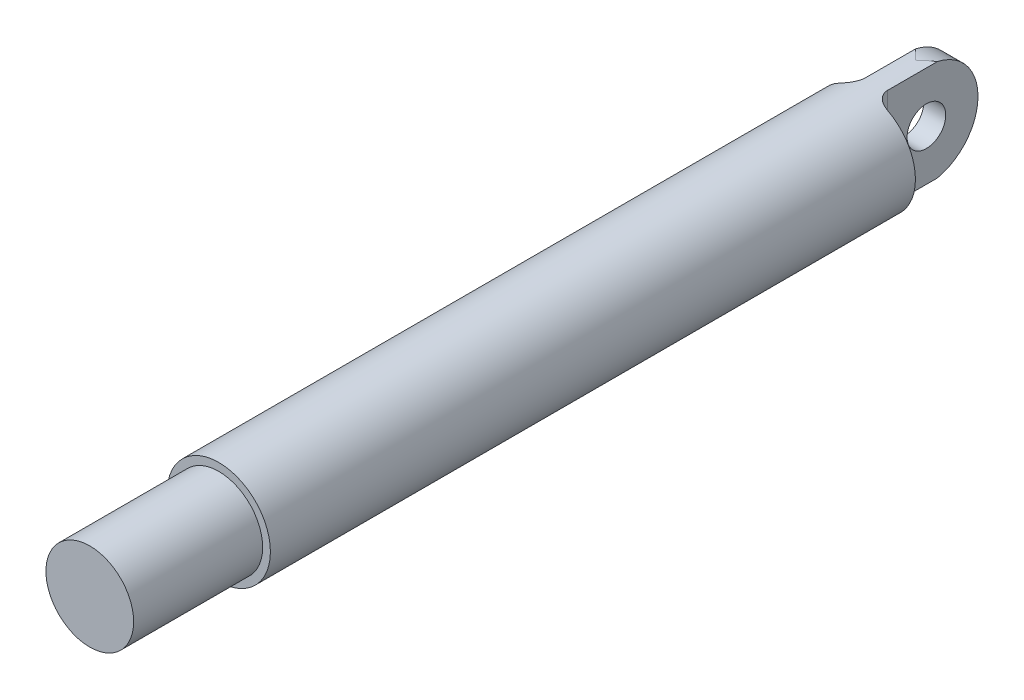
ISO-10303-21;
HEADER;
FILE_DESCRIPTION(('STEP AP214'),'2;1');
FILE_NAME('part.step','',(''),(''),'','','');
FILE_SCHEMA(('AUTOMOTIVE_DESIGN { 1 0 10303 214 1 1 1 1 }'));
ENDSEC;
DATA;
#1=APPLICATION_CONTEXT('core data for automotive mechanical design processes');
#2=APPLICATION_PROTOCOL_DEFINITION('international standard','automotive_design',2000,#1);
#3=PRODUCT_CONTEXT('',#1,'mechanical');
#4=PRODUCT('Part','Part','',(#3));
#5=PRODUCT_RELATED_PRODUCT_CATEGORY('part','',(#4));
#6=PRODUCT_DEFINITION_FORMATION('','',#4);
#7=PRODUCT_DEFINITION_CONTEXT('part definition',#1,'design');
#8=PRODUCT_DEFINITION('design','',#6,#7);
#9=PRODUCT_DEFINITION_SHAPE('','',#8);
#10=(LENGTH_UNIT() NAMED_UNIT(*) SI_UNIT(.MILLI.,.METRE.));
#11=(NAMED_UNIT(*) PLANE_ANGLE_UNIT() SI_UNIT($,.RADIAN.));
#12=(NAMED_UNIT(*) SI_UNIT($,.STERADIAN.) SOLID_ANGLE_UNIT());
#13=UNCERTAINTY_MEASURE_WITH_UNIT(LENGTH_MEASURE(1.E-05),#10,'distance_accuracy_value','');
#14=(GEOMETRIC_REPRESENTATION_CONTEXT(3) GLOBAL_UNCERTAINTY_ASSIGNED_CONTEXT((#13)) GLOBAL_UNIT_ASSIGNED_CONTEXT((#10,
#11,#12)) REPRESENTATION_CONTEXT('',''));
#15=CARTESIAN_POINT('',(0.,0.,0.));
#16=DIRECTION('',(0.,0.,1.));
#17=DIRECTION('',(1.,0.,0.));
#18=AXIS2_PLACEMENT_3D('',#15,#16,#17);
#19=CARTESIAN_POINT('',(4.25,0.,-270.));
#20=DIRECTION('',(1.,0.,0.));
#21=DIRECTION('',(0.,0.,-1.));
#22=AXIS2_PLACEMENT_3D('',#19,#20,#21);
#23=PLANE('',#22);
#24=CARTESIAN_POINT('',(4.25,0.,-270.));
#25=DIRECTION('',(1.,0.,0.));
#26=DIRECTION('',(0.,0.,-1.));
#27=AXIS2_PLACEMENT_3D('',#24,#25,#26);
#28=CIRCLE('',#27,7.50000000000001);
#29=CARTESIAN_POINT('',(4.25,0.,-277.5));
#30=VERTEX_POINT('',#29);
#31=EDGE_CURVE('E122',#30,#30,#28,.T.);
#32=ORIENTED_EDGE('',*,*,#31,.F.);
#33=EDGE_LOOP('',(#32));
#34=FACE_BOUND('',#33,.T.);
#35=DIRECTION('',(0.,0.,-1.));
#36=VECTOR('',#35,1.);
#37=CARTESIAN_POINT('',(4.25,19.5432213311931,50.));
#38=LINE('',#37,#36);
#39=CARTESIAN_POINT('',(4.25,19.5432213311931,-274.25));
#40=VERTEX_POINT('',#39);
#41=CARTESIAN_POINT('',(4.25,19.5432213311931,-255.));
#42=VERTEX_POINT('',#41);
#43=EDGE_CURVE('E190',#40,#42,#38,.F.);
#44=ORIENTED_EDGE('',*,*,#43,.T.);
#45=DIRECTION('',(0.,-1.,0.));
#46=VECTOR('',#45,1.);
#47=CARTESIAN_POINT('',(4.25,0.,-255.));
#48=LINE('',#47,#46);
#49=CARTESIAN_POINT('',(4.25,-19.5432213311931,-255.));
#50=VERTEX_POINT('',#49);
#51=EDGE_CURVE('E147',#42,#50,#48,.T.);
#52=ORIENTED_EDGE('',*,*,#51,.T.);
#53=DIRECTION('',(0.,0.,-1.));
#54=VECTOR('',#53,1.);
#55=CARTESIAN_POINT('',(4.25,-19.5432213311931,50.));
#56=LINE('',#55,#54);
#57=CARTESIAN_POINT('',(4.25,-19.5432213311931,-274.25));
#58=VERTEX_POINT('',#57);
#59=EDGE_CURVE('E188',#50,#58,#56,.T.);
#60=ORIENTED_EDGE('',*,*,#59,.T.);
#61=CARTESIAN_POINT('',(4.25,0.,-270.));
#62=DIRECTION('',(1.,0.,0.));
#63=DIRECTION('',(0.,0.,-1.));
#64=AXIS2_PLACEMENT_3D('',#61,#62,#63);
#65=CIRCLE('',#64,20.);
#66=EDGE_CURVE('E121',#58,#40,#65,.T.);
#67=ORIENTED_EDGE('',*,*,#66,.T.);
#68=EDGE_LOOP('',(#44,#52,#60,#67));
#69=FACE_BOUND('',#68,.T.);
#70=ADVANCED_FACE('F35',(#34,#69),#23,.T.);
#71=CARTESIAN_POINT('',(-4.25,0.,-270.));
#72=DIRECTION('',(1.,0.,0.));
#73=DIRECTION('',(0.,0.,-1.));
#74=AXIS2_PLACEMENT_3D('',#71,#72,#73);
#75=PLANE('',#74);
#76=CARTESIAN_POINT('',(-4.25,0.,-270.));
#77=DIRECTION('',(1.,0.,0.));
#78=DIRECTION('',(0.,0.,-1.));
#79=AXIS2_PLACEMENT_3D('',#76,#77,#78);
#80=CIRCLE('',#79,7.50000000000001);
#81=CARTESIAN_POINT('',(-4.25,0.,-277.5));
#82=VERTEX_POINT('',#81);
#83=EDGE_CURVE('E128',#82,#82,#80,.T.);
#84=ORIENTED_EDGE('',*,*,#83,.T.);
#85=EDGE_LOOP('',(#84));
#86=FACE_BOUND('',#85,.T.);
#87=DIRECTION('',(0.,0.,-1.));
#88=VECTOR('',#87,1.);
#89=CARTESIAN_POINT('',(-4.25,-19.5432213311931,50.));
#90=LINE('',#89,#88);
#91=CARTESIAN_POINT('',(-4.25,-19.5432213311931,-255.));
#92=VERTEX_POINT('',#91);
#93=CARTESIAN_POINT('',(-4.25,-19.5432213311931,-274.25));
#94=VERTEX_POINT('',#93);
#95=EDGE_CURVE('E116',#92,#94,#90,.T.);
#96=ORIENTED_EDGE('',*,*,#95,.F.);
#97=DIRECTION('',(0.,-1.,0.));
#98=VECTOR('',#97,1.);
#99=CARTESIAN_POINT('',(-4.25,19.5432213311931,-255.));
#100=LINE('',#99,#98);
#101=CARTESIAN_POINT('',(-4.25,19.5432213311931,-255.));
#102=VERTEX_POINT('',#101);
#103=EDGE_CURVE('E115',#92,#102,#100,.F.);
#104=ORIENTED_EDGE('',*,*,#103,.T.);
#105=DIRECTION('',(0.,0.,-1.));
#106=VECTOR('',#105,1.);
#107=CARTESIAN_POINT('',(-4.25,19.5432213311931,50.));
#108=LINE('',#107,#106);
#109=CARTESIAN_POINT('',(-4.25,19.5432213311931,-274.25));
#110=VERTEX_POINT('',#109);
#111=EDGE_CURVE('E101',#110,#102,#108,.F.);
#112=ORIENTED_EDGE('',*,*,#111,.F.);
#113=CARTESIAN_POINT('',(-4.25,0.,-270.));
#114=DIRECTION('',(1.,0.,0.));
#115=DIRECTION('',(0.,0.,-1.));
#116=AXIS2_PLACEMENT_3D('',#113,#114,#115);
#117=CIRCLE('',#116,20.);
#118=EDGE_CURVE('E113',#94,#110,#117,.T.);
#119=ORIENTED_EDGE('',*,*,#118,.F.);
#120=EDGE_LOOP('',(#96,#104,#112,#119));
#121=FACE_BOUND('',#120,.T.);
#122=ADVANCED_FACE('F112',(#86,#121),#75,.F.);
#123=CARTESIAN_POINT('',(4.25,0.,-270.));
#124=DIRECTION('',(-1.,0.,0.));
#125=DIRECTION('',(0.,0.,1.));
#126=AXIS2_PLACEMENT_3D('',#123,#124,#125);
#127=CYLINDRICAL_SURFACE('',#126,20.);
#128=CARTESIAN_POINT('',(0.,0.,-270.));
#129=DIRECTION('',(-0.707106781186547,0.,-0.707106781186547));
#130=DIRECTION('',(-0.707106781186547,0.,0.707106781186547));
#131=AXIS2_PLACEMENT_3D('',#128,#129,#130);
#132=ELLIPSE('',#131,28.2842712474619,20.);
#133=CARTESIAN_POINT('',(0.,20.,-270.));
#134=VERTEX_POINT('',#133);
#135=EDGE_CURVE('E104',#40,#134,#132,.F.);
#136=ORIENTED_EDGE('',*,*,#135,.F.);
#137=ORIENTED_EDGE('',*,*,#66,.F.);
#138=CARTESIAN_POINT('',(0.,-20.,-270.));
#139=VERTEX_POINT('',#138);
#140=EDGE_CURVE('E184',#139,#58,#132,.F.);
#141=ORIENTED_EDGE('',*,*,#140,.F.);
#142=CARTESIAN_POINT('',(0.,0.,-270.));
#143=DIRECTION('',(-0.707106781186547,0.,0.707106781186547));
#144=DIRECTION('',(-0.707106781186547,0.,-0.707106781186547));
#145=AXIS2_PLACEMENT_3D('',#142,#143,#144);
#146=ELLIPSE('',#145,28.2842712474619,20.);
#147=EDGE_CURVE('E108',#94,#139,#146,.T.);
#148=ORIENTED_EDGE('',*,*,#147,.F.);
#149=ORIENTED_EDGE('',*,*,#118,.T.);
#150=EDGE_CURVE('E97',#134,#110,#146,.T.);
#151=ORIENTED_EDGE('',*,*,#150,.F.);
#152=EDGE_LOOP('',(#136,#137,#141,#148,#149,#151));
#153=FACE_BOUND('',#152,.T.);
#154=ADVANCED_FACE('F119',(#153),#127,.T.);
#155=CARTESIAN_POINT('',(0.,0.,-250.));
#156=DIRECTION('',(0.,0.,1.));
#157=DIRECTION('',(1.,0.,0.));
#158=AXIS2_PLACEMENT_3D('',#155,#156,#157);
#159=PLANE('',#158);
#160=CARTESIAN_POINT('',(0.,0.,-250.));
#161=DIRECTION('',(0.,0.,1.));
#162=DIRECTION('',(1.,0.,0.));
#163=AXIS2_PLACEMENT_3D('',#160,#161,#162);
#164=CIRCLE('',#163,20.);
#165=CARTESIAN_POINT('',(9.25,-17.7323856263053,-250.));
#166=VERTEX_POINT('',#165);
#167=CARTESIAN_POINT('',(9.25,17.7323856263053,-250.));
#168=VERTEX_POINT('',#167);
#169=EDGE_CURVE('E140',#166,#168,#164,.T.);
#170=ORIENTED_EDGE('',*,*,#169,.F.);
#171=DIRECTION('',(0.,-1.,0.));
#172=VECTOR('',#171,1.);
#173=CARTESIAN_POINT('',(9.25,0.,-250.));
#174=LINE('',#173,#172);
#175=EDGE_CURVE('E55',#166,#168,#174,.F.);
#176=ORIENTED_EDGE('',*,*,#175,.T.);
#177=EDGE_LOOP('',(#170,#176));
#178=FACE_BOUND('',#177,.T.);
#179=ADVANCED_FACE('F168',(#178),#159,.F.);
#180=CARTESIAN_POINT('',(0.,0.,-250.));
#181=DIRECTION('',(0.,0.,1.));
#182=DIRECTION('',(1.,0.,0.));
#183=AXIS2_PLACEMENT_3D('',#180,#181,#182);
#184=CYLINDRICAL_SURFACE('',#183,20.);
#185=ORIENTED_EDGE('',*,*,#59,.F.);
#186=CARTESIAN_POINT('',(4.25,-19.5432213311931,-255.));
#187=CARTESIAN_POINT('',(4.24998351807279,-19.5432140005202,-254.862610201135));
#188=CARTESIAN_POINT('',(4.25566209277612,-19.5419896706019,-254.725222330896));
#189=CARTESIAN_POINT('',(4.27829072997005,-19.5370539365754,-254.451428615182));
#190=CARTESIAN_POINT('',(4.29524030853453,-19.5333426392463,-254.315022727799));
#191=CARTESIAN_POINT('',(4.3402733337141,-19.5233841077366,-254.044273492912));
#192=CARTESIAN_POINT('',(4.36834737067822,-19.5171390166654,-253.909928501693));
#193=CARTESIAN_POINT('',(4.43539461891231,-19.502011755574,-253.644140061068));
#194=CARTESIAN_POINT('',(4.47436767373509,-19.4931296234063,-253.512696570041));
#195=CARTESIAN_POINT('',(4.56290804514425,-19.4725943860146,-253.253598251336));
#196=CARTESIAN_POINT('',(4.61247907921736,-19.4609403083046,-253.125944771034));
#197=CARTESIAN_POINT('',(4.72181123480039,-19.4347024339761,-252.875334689281));
#198=CARTESIAN_POINT('',(4.78157610062521,-19.4201175604899,-252.752379834076));
#199=CARTESIAN_POINT('',(4.91073862747078,-19.387858877555,-252.512149739803));
#200=CARTESIAN_POINT('',(4.9801310403857,-19.3701867496593,-252.394871453027));
#201=CARTESIAN_POINT('',(5.12800046888428,-19.331566148526,-252.166696490152));
#202=CARTESIAN_POINT('',(5.20648081755547,-19.3106164722209,-252.055802177904));
#203=CARTESIAN_POINT('',(5.37180556161835,-19.2652808897491,-251.841210577309));
#204=CARTESIAN_POINT('',(5.45864872095948,-19.2408954911474,-251.737512229261));
#205=CARTESIAN_POINT('',(5.63997480667982,-19.1885275567289,-251.537933784275));
#206=CARTESIAN_POINT('',(5.73446050301509,-19.1605437145078,-251.442056547531));
#207=CARTESIAN_POINT('',(5.93015478781701,-19.1008826851982,-251.258798579018));
#208=CARTESIAN_POINT('',(6.03135970452742,-19.0692075082282,-251.171413270072));
#209=CARTESIAN_POINT('',(6.23968778042244,-19.0020597890867,-251.005534220303));
#210=CARTESIAN_POINT('',(6.346813121334,-18.9665858424597,-250.927043790262));
#211=CARTESIAN_POINT('',(6.56744296544196,-18.8913326404711,-250.778411747313));
#212=CARTESIAN_POINT('',(6.6810120472705,-18.8515036427277,-250.708391223716));
#213=CARTESIAN_POINT('',(6.91230320159097,-18.7679299063046,-250.578145357074));
#214=CARTESIAN_POINT('',(7.0300267771558,-18.7241837414305,-250.517923604312));
#215=CARTESIAN_POINT('',(7.26868923325148,-18.6328332760223,-250.407429689805));
#216=CARTESIAN_POINT('',(7.38962972041244,-18.585227022366,-250.357162609751));
#217=CARTESIAN_POINT('',(7.63373440465237,-18.4863055923082,-250.266643972269));
#218=CARTESIAN_POINT('',(7.75689937522216,-18.4349891064158,-250.226395973468));
#219=CARTESIAN_POINT('',(8.10804542930168,-18.284432727115,-250.126431000466));
#220=CARTESIAN_POINT('',(8.33771061579063,-18.1809423148409,-250.078502136869));
#221=CARTESIAN_POINT('',(8.6812772645236,-18.0180900837307,-250.031102463793));
#222=CARTESIAN_POINT('',(8.79553265271883,-17.9625947387204,-250.019384371358));
#223=CARTESIAN_POINT('',(9.02336842925477,-17.849229624705,-250.003837377005));
#224=CARTESIAN_POINT('',(9.1369489755395,-17.7913604385432,-250.000006550233));
#225=CARTESIAN_POINT('',(9.25000000000001,-17.7323856263053,-250.));
#226=B_SPLINE_CURVE_WITH_KNOTS('',3,(#186,#187,#188,#189,#190,#191,#192,#193,#194,#195,#196,
#197,#198,#199,#200,#201,#202,#203,#204,#205,#206,#207,#208,#209,#210,#211,#212,#213,#214,#215,
#216,#217,#218,#219,#220,#221,#222,#223,#224,#225),.UNSPECIFIED.,.F.,.F.,(4,2,2,2,2,2,2,2,2,2,2,
2,2,2,2,2,2,2,2,4),(0.,0.412043965436492,0.824070240704146,1.23574874392357,1.64742133811142,
2.05923857361914,2.47120740150374,2.88295253556501,3.2948491622613,3.70668500246844,
4.11867078284133,4.53043325531972,4.94234849089708,5.35959045287343,5.77698495026369,
6.19459197424433,6.61234711497267,7.37877720630159,7.76124252081663,8.14361448516319),.UNSPECIFIED.);
#227=EDGE_CURVE('E49',#50,#166,#226,.T.);
#228=ORIENTED_EDGE('',*,*,#227,.T.);
#229=ORIENTED_EDGE('',*,*,#169,.T.);
#230=CARTESIAN_POINT('',(9.25,17.7323856263053,-250.));
#231=CARTESIAN_POINT('',(9.11174785486749,17.8045225289416,-249.9999890528));
#232=CARTESIAN_POINT('',(8.97260746960244,17.8750294432244,-250.005734583656));
#233=CARTESIAN_POINT('',(8.6934556011172,18.0124365497774,-250.029098624584));
#234=CARTESIAN_POINT('',(8.55344368373647,18.0793347516506,-250.046723615937));
#235=CARTESIAN_POINT('',(8.2731767617439,18.2092976953352,-250.094280437389));
#236=CARTESIAN_POINT('',(8.13292233463046,18.2723500091984,-250.124249965899));
#237=CARTESIAN_POINT('',(7.85377535961566,18.394058280111,-250.19673605936));
#238=CARTESIAN_POINT('',(7.71488257257079,18.4527150216246,-250.239250378762));
#239=CARTESIAN_POINT('',(7.43915461655995,18.5655933839796,-250.337133905257));
#240=CARTESIAN_POINT('',(7.30232928329178,18.6197972869001,-250.39255139184));
#241=CARTESIAN_POINT('',(7.03263263683986,18.7233261329523,-250.516108894234));
#242=CARTESIAN_POINT('',(6.89976111719696,18.7726513311524,-250.584248244381));
#243=CARTESIAN_POINT('',(6.63958863442386,18.8662382426336,-250.732898009091));
#244=CARTESIAN_POINT('',(6.51227832493015,18.9105086705613,-250.813386553737));
#245=CARTESIAN_POINT('',(6.26438672848104,18.9940666484413,-250.986403870274));
#246=CARTESIAN_POINT('',(6.1438048093996,19.0333546669291,-251.078931508374));
#247=CARTESIAN_POINT('',(5.91977680761288,19.1041608133274,-251.267790926991));
#248=CARTESIAN_POINT('',(5.81572707212934,19.1360452728046,-251.363270640825));
#249=CARTESIAN_POINT('',(5.61552484513778,19.1957493578671,-251.56334257891));
#250=CARTESIAN_POINT('',(5.51937191751062,19.2235692079958,-251.667934299271));
#251=CARTESIAN_POINT('',(5.33586343411175,19.2753121455658,-251.885549317684));
#252=CARTESIAN_POINT('',(5.24851183621535,19.2992334828416,-251.998576369607));
#253=CARTESIAN_POINT('',(5.08351005508208,19.3433508463537,-252.23218333241));
#254=CARTESIAN_POINT('',(5.00585950836229,19.3635470121798,-252.352762960052));
#255=CARTESIAN_POINT('',(4.8641537118789,19.3996165494492,-252.595171444892));
#256=CARTESIAN_POINT('',(4.7996546779643,19.4156394923752,-252.716718953359));
#257=CARTESIAN_POINT('',(4.68078018935794,19.4446404182345,-252.965012317462));
#258=CARTESIAN_POINT('',(4.62640435891729,19.4576185141898,-253.091757979943));
#259=CARTESIAN_POINT('',(4.52827778335969,19.4806890359017,-253.349445291959));
#260=CARTESIAN_POINT('',(4.48451923474279,19.490783581986,-253.480383779233));
#261=CARTESIAN_POINT('',(4.40795307110934,19.5082412301827,-253.745555730732));
#262=CARTESIAN_POINT('',(4.37514242979629,19.5156050871938,-253.87978827336));
#263=CARTESIAN_POINT('',(4.31540140867774,19.5289144075864,-254.177200712943));
#264=CARTESIAN_POINT('',(4.29088510395699,19.534298725461,-254.340896236677));
#265=CARTESIAN_POINT('',(4.25817790120643,19.5414421180999,-254.669733929256));
#266=CARTESIAN_POINT('',(4.24996204463317,19.5432067353344,-254.834873496977));
#267=CARTESIAN_POINT('',(4.25,19.5432213311931,-255.));
#268=B_SPLINE_CURVE_WITH_KNOTS('',3,(#230,#231,#232,#233,#234,#235,#236,#237,#238,#239,#240,
#241,#242,#243,#244,#245,#246,#247,#248,#249,#250,#251,#252,#253,#254,#255,#256,#257,#258,#259,
#260,#261,#262,#263,#264,#265,#266,#267),.UNSPECIFIED.,.F.,.F.,(4,2,2,2,2,2,2,2,2,2,2,2,2,2,2,2,
2,2,4),(0.,0.467754149457543,0.935763706354635,1.40521321888941,1.87457874969975,
2.34572954837947,2.81685570130873,3.28715693972714,3.75741391912817,4.19118708668353,
4.62493628199961,5.05887966778275,5.49280678951904,5.90790098506405,6.32297977024074,
6.73775254995485,7.15241058013018,7.64836570261082,8.1435608521313),.UNSPECIFIED.);
#269=EDGE_CURVE('E12',#168,#42,#268,.T.);
#270=ORIENTED_EDGE('',*,*,#269,.T.);
#271=ORIENTED_EDGE('',*,*,#43,.F.);
#272=ORIENTED_EDGE('',*,*,#135,.T.);
#273=ORIENTED_EDGE('',*,*,#150,.T.);
#274=ORIENTED_EDGE('',*,*,#111,.T.);
#275=CARTESIAN_POINT('',(-4.25,19.5432213311931,-255.));
#276=CARTESIAN_POINT('',(-4.24998351807279,19.5432140005202,-254.862610201135));
#277=CARTESIAN_POINT('',(-4.25566209277612,19.5419896706019,-254.725222330896));
#278=CARTESIAN_POINT('',(-4.27829072997005,19.5370539365754,-254.451428615182));
#279=CARTESIAN_POINT('',(-4.29524030853453,19.5333426392463,-254.315022727799));
#280=CARTESIAN_POINT('',(-4.3402733337141,19.5233841077366,-254.044273492912));
#281=CARTESIAN_POINT('',(-4.36834737067822,19.5171390166654,-253.909928501693));
#282=CARTESIAN_POINT('',(-4.43539461891231,19.502011755574,-253.644140061068));
#283=CARTESIAN_POINT('',(-4.47436767373509,19.4931296234063,-253.512696570041));
#284=CARTESIAN_POINT('',(-4.56290804514425,19.4725943860146,-253.253598251336));
#285=CARTESIAN_POINT('',(-4.61247907921736,19.4609403083046,-253.125944771034));
#286=CARTESIAN_POINT('',(-4.72181123480039,19.4347024339761,-252.875334689281));
#287=CARTESIAN_POINT('',(-4.78157610062521,19.4201175604899,-252.752379834076));
#288=CARTESIAN_POINT('',(-4.91073862747078,19.387858877555,-252.512149739803));
#289=CARTESIAN_POINT('',(-4.9801310403857,19.3701867496593,-252.394871453027));
#290=CARTESIAN_POINT('',(-5.12800046888428,19.331566148526,-252.166696490152));
#291=CARTESIAN_POINT('',(-5.20648081755547,19.3106164722209,-252.055802177904));
#292=CARTESIAN_POINT('',(-5.37180556161835,19.2652808897491,-251.841210577309));
#293=CARTESIAN_POINT('',(-5.45864872095948,19.2408954911474,-251.737512229261));
#294=CARTESIAN_POINT('',(-5.63997480667982,19.1885275567289,-251.537933784275));
#295=CARTESIAN_POINT('',(-5.73446050301509,19.1605437145078,-251.442056547531));
#296=CARTESIAN_POINT('',(-5.93015478781701,19.1008826851982,-251.258798579018));
#297=CARTESIAN_POINT('',(-6.03135970452742,19.0692075082282,-251.171413270072));
#298=CARTESIAN_POINT('',(-6.23968778042244,19.0020597890867,-251.005534220303));
#299=CARTESIAN_POINT('',(-6.346813121334,18.9665858424597,-250.927043790262));
#300=CARTESIAN_POINT('',(-6.56744296544196,18.8913326404711,-250.778411747313));
#301=CARTESIAN_POINT('',(-6.6810120472705,18.8515036427277,-250.708391223716));
#302=CARTESIAN_POINT('',(-6.91230320159097,18.7679299063046,-250.578145357074));
#303=CARTESIAN_POINT('',(-7.0300267771558,18.7241837414305,-250.517923604312));
#304=CARTESIAN_POINT('',(-7.26868923325148,18.6328332760223,-250.407429689805));
#305=CARTESIAN_POINT('',(-7.38962972041244,18.585227022366,-250.357162609751));
#306=CARTESIAN_POINT('',(-7.63373440465237,18.4863055923082,-250.266643972269));
#307=CARTESIAN_POINT('',(-7.75689937522216,18.4349891064158,-250.226395973468));
#308=CARTESIAN_POINT('',(-8.10804542930168,18.284432727115,-250.126431000466));
#309=CARTESIAN_POINT('',(-8.33771061579063,18.1809423148409,-250.078502136869));
#310=CARTESIAN_POINT('',(-8.6812772645236,18.0180900837307,-250.031102463793));
#311=CARTESIAN_POINT('',(-8.79553265271883,17.9625947387204,-250.019384371358));
#312=CARTESIAN_POINT('',(-9.02336842925477,17.849229624705,-250.003837377005));
#313=CARTESIAN_POINT('',(-9.1369489755395,17.7913604385432,-250.000006550233));
#314=CARTESIAN_POINT('',(-9.25000000000001,17.7323856263053,-250.));
#315=B_SPLINE_CURVE_WITH_KNOTS('',3,(#275,#276,#277,#278,#279,#280,#281,#282,#283,#284,#285,
#286,#287,#288,#289,#290,#291,#292,#293,#294,#295,#296,#297,#298,#299,#300,#301,#302,#303,#304,
#305,#306,#307,#308,#309,#310,#311,#312,#313,#314),.UNSPECIFIED.,.F.,.F.,(4,2,2,2,2,2,2,2,2,2,2,
2,2,2,2,2,2,2,2,4),(0.,0.412043965436492,0.824070240704146,1.23574874392357,1.64742133811142,
2.05923857361914,2.47120740150374,2.88295253556501,3.2948491622613,3.70668500246844,
4.11867078284133,4.53043325531972,4.94234849089708,5.35959045287343,5.77698495026369,
6.19459197424433,6.61234711497267,7.37877720630159,7.76124252081663,8.14361448516319),.UNSPECIFIED.);
#316=CARTESIAN_POINT('',(-9.25,17.7323856263053,-250.));
#317=VERTEX_POINT('',#316);
#318=EDGE_CURVE('E157',#102,#317,#315,.T.);
#319=ORIENTED_EDGE('',*,*,#318,.T.);
#320=CARTESIAN_POINT('',(-9.25,-17.7323856263053,-250.));
#321=VERTEX_POINT('',#320);
#322=EDGE_CURVE('E139',#317,#321,#164,.T.);
#323=ORIENTED_EDGE('',*,*,#322,.T.);
#324=CARTESIAN_POINT('',(-9.25,-17.7323856263053,-250.));
#325=CARTESIAN_POINT('',(-9.11174785486749,-17.8045225289416,-249.9999890528));
#326=CARTESIAN_POINT('',(-8.97260746960244,-17.8750294432244,-250.005734583656));
#327=CARTESIAN_POINT('',(-8.6934556011172,-18.0124365497774,-250.029098624584));
#328=CARTESIAN_POINT('',(-8.55344368373647,-18.0793347516506,-250.046723615937));
#329=CARTESIAN_POINT('',(-8.2731767617439,-18.2092976953352,-250.094280437389));
#330=CARTESIAN_POINT('',(-8.13292233463046,-18.2723500091984,-250.124249965899));
#331=CARTESIAN_POINT('',(-7.85377535961566,-18.394058280111,-250.19673605936));
#332=CARTESIAN_POINT('',(-7.71488257257079,-18.4527150216246,-250.239250378762));
#333=CARTESIAN_POINT('',(-7.43915461655995,-18.5655933839796,-250.337133905257));
#334=CARTESIAN_POINT('',(-7.30232928329178,-18.6197972869001,-250.39255139184));
#335=CARTESIAN_POINT('',(-7.03263263683986,-18.7233261329523,-250.516108894234));
#336=CARTESIAN_POINT('',(-6.89976111719696,-18.7726513311524,-250.584248244381));
#337=CARTESIAN_POINT('',(-6.63958863442386,-18.8662382426336,-250.732898009091));
#338=CARTESIAN_POINT('',(-6.51227832493015,-18.9105086705613,-250.813386553737));
#339=CARTESIAN_POINT('',(-6.26438672848104,-18.9940666484413,-250.986403870274));
#340=CARTESIAN_POINT('',(-6.1438048093996,-19.0333546669291,-251.078931508374));
#341=CARTESIAN_POINT('',(-5.91977680761288,-19.1041608133274,-251.267790926991));
#342=CARTESIAN_POINT('',(-5.81572707212934,-19.1360452728046,-251.363270640825));
#343=CARTESIAN_POINT('',(-5.61552484513778,-19.1957493578671,-251.56334257891));
#344=CARTESIAN_POINT('',(-5.51937191751062,-19.2235692079958,-251.667934299271));
#345=CARTESIAN_POINT('',(-5.33586343411175,-19.2753121455658,-251.885549317684));
#346=CARTESIAN_POINT('',(-5.24851183621535,-19.2992334828416,-251.998576369607));
#347=CARTESIAN_POINT('',(-5.08351005508208,-19.3433508463537,-252.23218333241));
#348=CARTESIAN_POINT('',(-5.00585950836229,-19.3635470121798,-252.352762960052));
#349=CARTESIAN_POINT('',(-4.8641537118789,-19.3996165494492,-252.595171444892));
#350=CARTESIAN_POINT('',(-4.7996546779643,-19.4156394923752,-252.716718953359));
#351=CARTESIAN_POINT('',(-4.68078018935794,-19.4446404182345,-252.965012317462));
#352=CARTESIAN_POINT('',(-4.62640435891729,-19.4576185141898,-253.091757979943));
#353=CARTESIAN_POINT('',(-4.52827778335969,-19.4806890359017,-253.349445291959));
#354=CARTESIAN_POINT('',(-4.48451923474279,-19.490783581986,-253.480383779233));
#355=CARTESIAN_POINT('',(-4.40795307110934,-19.5082412301827,-253.745555730732));
#356=CARTESIAN_POINT('',(-4.37514242979629,-19.5156050871938,-253.87978827336));
#357=CARTESIAN_POINT('',(-4.31540140867774,-19.5289144075864,-254.177200712943));
#358=CARTESIAN_POINT('',(-4.29088510395699,-19.534298725461,-254.340896236677));
#359=CARTESIAN_POINT('',(-4.25817790120643,-19.5414421180999,-254.669733929256));
#360=CARTESIAN_POINT('',(-4.24996204463317,-19.5432067353344,-254.834873496977));
#361=CARTESIAN_POINT('',(-4.25,-19.5432213311931,-255.));
#362=B_SPLINE_CURVE_WITH_KNOTS('',3,(#324,#325,#326,#327,#328,#329,#330,#331,#332,#333,#334,
#335,#336,#337,#338,#339,#340,#341,#342,#343,#344,#345,#346,#347,#348,#349,#350,#351,#352,#353,
#354,#355,#356,#357,#358,#359,#360,#361),.UNSPECIFIED.,.F.,.F.,(4,2,2,2,2,2,2,2,2,2,2,2,2,2,2,2,
2,2,4),(0.,0.467754149457543,0.935763706354635,1.40521321888941,1.87457874969975,
2.34572954837947,2.81685570130873,3.28715693972714,3.75741391912817,4.19118708668353,
4.62493628199961,5.05887966778275,5.49280678951904,5.90790098506405,6.32297977024074,
6.73775254995485,7.15241058013018,7.64836570261082,8.1435608521313),.UNSPECIFIED.);
#363=EDGE_CURVE('E151',#321,#92,#362,.T.);
#364=ORIENTED_EDGE('',*,*,#363,.T.);
#365=ORIENTED_EDGE('',*,*,#95,.T.);
#366=ORIENTED_EDGE('',*,*,#147,.T.);
#367=ORIENTED_EDGE('',*,*,#140,.T.);
#368=EDGE_LOOP('',(#185,#228,#229,#270,#271,#272,#273,#274,#319,#323,#364,#365,#366,#367));
#369=FACE_BOUND('',#368,.T.);
#370=CARTESIAN_POINT('',(0.,0.,0.));
#371=DIRECTION('',(0.,0.,1.));
#372=DIRECTION('',(1.,0.,0.));
#373=AXIS2_PLACEMENT_3D('',#370,#371,#372);
#374=CIRCLE('',#373,20.);
#375=CARTESIAN_POINT('',(20.,0.,0.));
#376=VERTEX_POINT('',#375);
#377=EDGE_CURVE('E134',#376,#376,#374,.T.);
#378=ORIENTED_EDGE('',*,*,#377,.F.);
#379=EDGE_LOOP('',(#378));
#380=FACE_BOUND('',#379,.T.);
#381=ADVANCED_FACE('F99',(#369,#380),#184,.T.);
#382=ORIENTED_EDGE('',*,*,#322,.F.);
#383=DIRECTION('',(0.,-1.,0.));
#384=VECTOR('',#383,1.);
#385=CARTESIAN_POINT('',(-9.25,-19.5432213311931,-250.));
#386=LINE('',#385,#384);
#387=EDGE_CURVE('E138',#317,#321,#386,.T.);
#388=ORIENTED_EDGE('',*,*,#387,.T.);
#389=EDGE_LOOP('',(#382,#388));
#390=FACE_BOUND('',#389,.T.);
#391=ADVANCED_FACE('F167',(#390),#159,.F.);
#392=CARTESIAN_POINT('',(0.,0.,0.));
#393=DIRECTION('',(0.,0.,1.));
#394=DIRECTION('',(1.,0.,0.));
#395=AXIS2_PLACEMENT_3D('',#392,#393,#394);
#396=PLANE('',#395);
#397=CARTESIAN_POINT('',(0.,0.,0.));
#398=DIRECTION('',(0.,0.,1.));
#399=DIRECTION('',(1.,0.,0.));
#400=AXIS2_PLACEMENT_3D('',#397,#398,#399);
#401=CIRCLE('',#400,17.);
#402=CARTESIAN_POINT('',(17.,0.,0.));
#403=VERTEX_POINT('',#402);
#404=EDGE_CURVE('E135',#403,#403,#401,.T.);
#405=ORIENTED_EDGE('',*,*,#404,.F.);
#406=EDGE_LOOP('',(#405));
#407=FACE_BOUND('',#406,.T.);
#408=ORIENTED_EDGE('',*,*,#377,.T.);
#409=EDGE_LOOP('',(#408));
#410=FACE_BOUND('',#409,.T.);
#411=ADVANCED_FACE('F169',(#407,#410),#396,.T.);
#412=CARTESIAN_POINT('',(0.,0.,50.));
#413=DIRECTION('',(0.,0.,-1.));
#414=DIRECTION('',(-1.,0.,0.));
#415=AXIS2_PLACEMENT_3D('',#412,#413,#414);
#416=CYLINDRICAL_SURFACE('',#415,17.);
#417=CARTESIAN_POINT('',(0.,0.,50.));
#418=DIRECTION('',(0.,0.,1.));
#419=DIRECTION('',(1.,0.,0.));
#420=AXIS2_PLACEMENT_3D('',#417,#418,#419);
#421=CIRCLE('',#420,17.);
#422=CARTESIAN_POINT('',(17.,0.,50.));
#423=VERTEX_POINT('',#422);
#424=EDGE_CURVE('E125',#423,#423,#421,.T.);
#425=ORIENTED_EDGE('',*,*,#424,.F.);
#426=EDGE_LOOP('',(#425));
#427=FACE_BOUND('',#426,.T.);
#428=ORIENTED_EDGE('',*,*,#404,.T.);
#429=EDGE_LOOP('',(#428));
#430=FACE_BOUND('',#429,.T.);
#431=ADVANCED_FACE('F205',(#427,#430),#416,.T.);
#432=CARTESIAN_POINT('',(0.,0.,50.));
#433=DIRECTION('',(0.,0.,1.));
#434=DIRECTION('',(1.,0.,0.));
#435=AXIS2_PLACEMENT_3D('',#432,#433,#434);
#436=PLANE('',#435);
#437=ORIENTED_EDGE('',*,*,#424,.T.);
#438=EDGE_LOOP('',(#437));
#439=FACE_BOUND('',#438,.T.);
#440=ADVANCED_FACE('F198',(#439),#436,.T.);
#441=CARTESIAN_POINT('',(4.25,0.,-270.));
#442=DIRECTION('',(-1.,0.,0.));
#443=DIRECTION('',(0.,0.,1.));
#444=AXIS2_PLACEMENT_3D('',#441,#442,#443);
#445=CYLINDRICAL_SURFACE('',#444,7.50000000000001);
#446=ORIENTED_EDGE('',*,*,#31,.T.);
#447=EDGE_LOOP('',(#446));
#448=FACE_BOUND('',#447,.T.);
#449=ORIENTED_EDGE('',*,*,#83,.F.);
#450=EDGE_LOOP('',(#449));
#451=FACE_BOUND('',#450,.T.);
#452=ADVANCED_FACE('F196',(#448,#451),#445,.F.);
#453=CARTESIAN_POINT('',(-9.25,0.,-255.));
#454=DIRECTION('',(0.,1.,0.));
#455=DIRECTION('',(0.,0.,1.));
#456=AXIS2_PLACEMENT_3D('',#453,#454,#455);
#457=CYLINDRICAL_SURFACE('',#456,5.);
#458=ORIENTED_EDGE('',*,*,#318,.F.);
#459=ORIENTED_EDGE('',*,*,#103,.F.);
#460=ORIENTED_EDGE('',*,*,#363,.F.);
#461=ORIENTED_EDGE('',*,*,#387,.F.);
#462=EDGE_LOOP('',(#458,#459,#460,#461));
#463=FACE_BOUND('',#462,.T.);
#464=ADVANCED_FACE('F162',(#463),#457,.F.);
#465=CARTESIAN_POINT('',(9.25,0.,-255.));
#466=DIRECTION('',(0.,-1.,0.));
#467=DIRECTION('',(0.,0.,-1.));
#468=AXIS2_PLACEMENT_3D('',#465,#466,#467);
#469=CYLINDRICAL_SURFACE('',#468,5.);
#470=ORIENTED_EDGE('',*,*,#269,.F.);
#471=ORIENTED_EDGE('',*,*,#175,.F.);
#472=ORIENTED_EDGE('',*,*,#227,.F.);
#473=ORIENTED_EDGE('',*,*,#51,.F.);
#474=EDGE_LOOP('',(#470,#471,#472,#473));
#475=FACE_BOUND('',#474,.T.);
#476=ADVANCED_FACE('F37',(#475),#469,.F.);
#477=CLOSED_SHELL('',(#70,#122,#154,#179,#381,#391,#411,#431,#440,#452,#464,#476));
#478=MANIFOLD_SOLID_BREP('B2',#477);
#479=ADVANCED_BREP_SHAPE_REPRESENTATION('',(#18,#478),#14);
#480=SHAPE_DEFINITION_REPRESENTATION(#9,#479);
ENDSEC;
END-ISO-10303-21;
